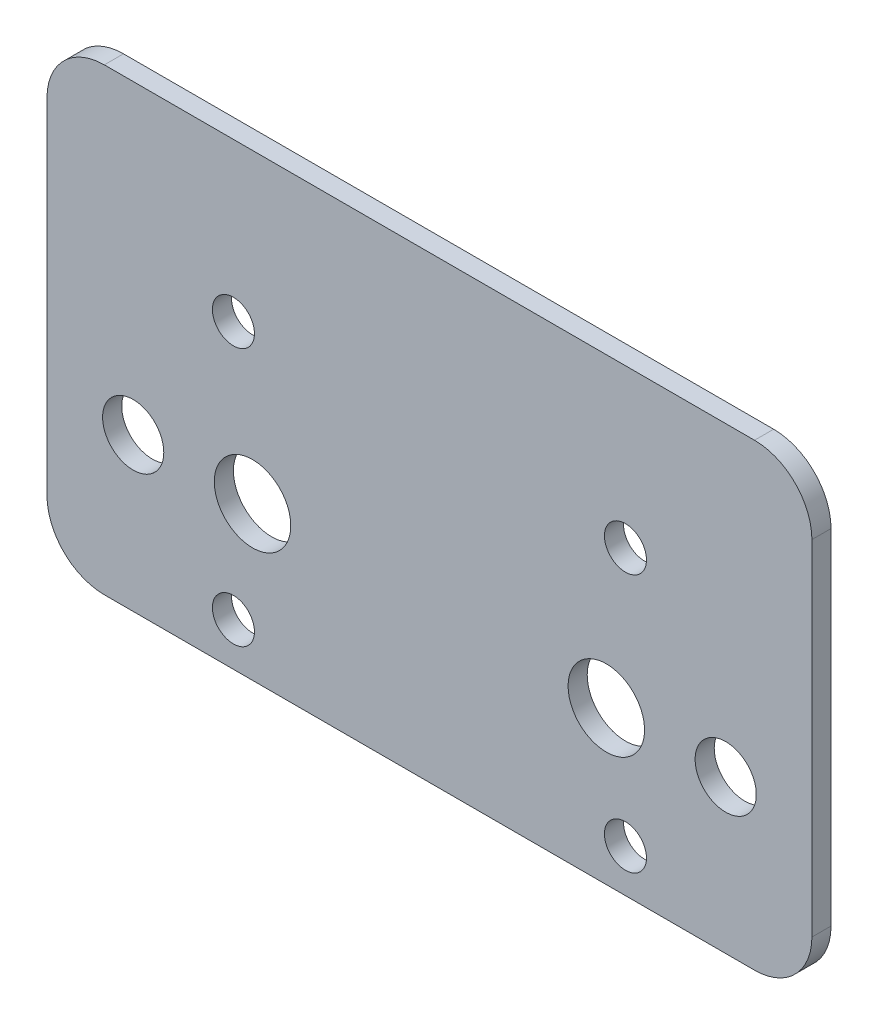
ISO-10303-21;
HEADER;
FILE_DESCRIPTION(('STEP AP214'),'2;1');
FILE_NAME('part.step','',(''),(''),'','','');
FILE_SCHEMA(('AUTOMOTIVE_DESIGN { 1 0 10303 214 1 1 1 1 }'));
ENDSEC;
DATA;
#1=APPLICATION_CONTEXT('core data for automotive mechanical design processes');
#2=APPLICATION_PROTOCOL_DEFINITION('international standard','automotive_design',2000,#1);
#3=PRODUCT_CONTEXT('',#1,'mechanical');
#4=PRODUCT('Part','Part','',(#3));
#5=PRODUCT_RELATED_PRODUCT_CATEGORY('part','',(#4));
#6=PRODUCT_DEFINITION_FORMATION('','',#4);
#7=PRODUCT_DEFINITION_CONTEXT('part definition',#1,'design');
#8=PRODUCT_DEFINITION('design','',#6,#7);
#9=PRODUCT_DEFINITION_SHAPE('','',#8);
#10=(LENGTH_UNIT() NAMED_UNIT(*) SI_UNIT(.MILLI.,.METRE.));
#11=(NAMED_UNIT(*) PLANE_ANGLE_UNIT() SI_UNIT($,.RADIAN.));
#12=(NAMED_UNIT(*) SI_UNIT($,.STERADIAN.) SOLID_ANGLE_UNIT());
#13=UNCERTAINTY_MEASURE_WITH_UNIT(LENGTH_MEASURE(1.E-05),#10,'distance_accuracy_value','');
#14=(GEOMETRIC_REPRESENTATION_CONTEXT(3) GLOBAL_UNCERTAINTY_ASSIGNED_CONTEXT((#13)) GLOBAL_UNIT_ASSIGNED_CONTEXT((#10,
#11,#12)) REPRESENTATION_CONTEXT('',''));
#15=CARTESIAN_POINT('',(0.,0.,0.));
#16=DIRECTION('',(0.,0.,1.));
#17=DIRECTION('',(1.,0.,0.));
#18=AXIS2_PLACEMENT_3D('',#15,#16,#17);
#19=CARTESIAN_POINT('',(0.,0.,1.));
#20=DIRECTION('',(0.,0.,1.));
#21=DIRECTION('',(1.,0.,0.));
#22=AXIS2_PLACEMENT_3D('',#19,#20,#21);
#23=PLANE('',#22);
#24=CARTESIAN_POINT('',(10.25,3.75,1.));
#25=DIRECTION('',(0.,0.,-1.));
#26=DIRECTION('',(-1.,0.,0.));
#27=AXIS2_PLACEMENT_3D('',#24,#25,#26);
#28=CIRCLE('',#27,1.1);
#29=CARTESIAN_POINT('',(9.15,3.75,1.));
#30=VERTEX_POINT('',#29);
#31=EDGE_CURVE('E260',#30,#30,#28,.T.);
#32=ORIENTED_EDGE('',*,*,#31,.T.);
#33=EDGE_LOOP('',(#32));
#34=FACE_BOUND('',#33,.T.);
#35=CARTESIAN_POINT('',(-10.25,-9.75,1.));
#36=DIRECTION('',(0.,0.,-1.));
#37=DIRECTION('',(-1.,0.,0.));
#38=AXIS2_PLACEMENT_3D('',#35,#36,#37);
#39=CIRCLE('',#38,1.1);
#40=CARTESIAN_POINT('',(-11.35,-9.75,1.));
#41=VERTEX_POINT('',#40);
#42=EDGE_CURVE('E245',#41,#41,#39,.T.);
#43=ORIENTED_EDGE('',*,*,#42,.T.);
#44=EDGE_LOOP('',(#43));
#45=FACE_BOUND('',#44,.T.);
#46=CARTESIAN_POINT('',(-9.25000000000001,-3.99999999999999,1.));
#47=DIRECTION('',(0.,0.,-1.));
#48=DIRECTION('',(-1.,0.,0.));
#49=AXIS2_PLACEMENT_3D('',#46,#47,#48);
#50=CIRCLE('',#49,2.);
#51=CARTESIAN_POINT('',(-11.25,-3.99999999999999,1.));
#52=VERTEX_POINT('',#51);
#53=EDGE_CURVE('E244',#52,#52,#50,.T.);
#54=ORIENTED_EDGE('',*,*,#53,.T.);
#55=EDGE_LOOP('',(#54));
#56=FACE_BOUND('',#55,.T.);
#57=CARTESIAN_POINT('',(-10.25,3.75,1.));
#58=DIRECTION('',(0.,0.,-1.));
#59=DIRECTION('',(-1.,0.,0.));
#60=AXIS2_PLACEMENT_3D('',#57,#58,#59);
#61=CIRCLE('',#60,1.1);
#62=CARTESIAN_POINT('',(-11.35,3.75,1.));
#63=VERTEX_POINT('',#62);
#64=EDGE_CURVE('E236',#63,#63,#61,.T.);
#65=ORIENTED_EDGE('',*,*,#64,.T.);
#66=EDGE_LOOP('',(#65));
#67=FACE_BOUND('',#66,.T.);
#68=CARTESIAN_POINT('',(10.25,-9.75,1.));
#69=DIRECTION('',(0.,0.,-1.));
#70=DIRECTION('',(-1.,0.,0.));
#71=AXIS2_PLACEMENT_3D('',#68,#69,#70);
#72=CIRCLE('',#71,1.1);
#73=CARTESIAN_POINT('',(9.15,-9.75,1.));
#74=VERTEX_POINT('',#73);
#75=EDGE_CURVE('E261',#74,#74,#72,.T.);
#76=ORIENTED_EDGE('',*,*,#75,.T.);
#77=EDGE_LOOP('',(#76));
#78=FACE_BOUND('',#77,.T.);
#79=CARTESIAN_POINT('',(9.24999999999999,-3.99999999999999,1.));
#80=DIRECTION('',(0.,0.,-1.));
#81=DIRECTION('',(-1.,0.,0.));
#82=AXIS2_PLACEMENT_3D('',#79,#80,#81);
#83=CIRCLE('',#82,2.);
#84=CARTESIAN_POINT('',(7.24999999999999,-3.99999999999999,1.));
#85=VERTEX_POINT('',#84);
#86=EDGE_CURVE('E228',#85,#85,#83,.T.);
#87=ORIENTED_EDGE('',*,*,#86,.T.);
#88=EDGE_LOOP('',(#87));
#89=FACE_BOUND('',#88,.T.);
#90=CARTESIAN_POINT('',(-15.4919333848297,-4.,1.));
#91=DIRECTION('',(0.,0.,1.));
#92=DIRECTION('',(1.,0.,0.));
#93=AXIS2_PLACEMENT_3D('',#90,#91,#92);
#94=CIRCLE('',#93,1.6);
#95=CARTESIAN_POINT('',(-13.8919333848297,-4.,1.));
#96=VERTEX_POINT('',#95);
#97=EDGE_CURVE('E134',#96,#96,#94,.T.);
#98=ORIENTED_EDGE('',*,*,#97,.F.);
#99=EDGE_LOOP('',(#98));
#100=FACE_BOUND('',#99,.T.);
#101=DIRECTION('',(-1.,0.,0.));
#102=VECTOR('',#101,1.);
#103=CARTESIAN_POINT('',(20.,12.,1.));
#104=LINE('',#103,#102);
#105=CARTESIAN_POINT('',(17.,12.,1.));
#106=VERTEX_POINT('',#105);
#107=CARTESIAN_POINT('',(-17.,12.,1.));
#108=VERTEX_POINT('',#107);
#109=EDGE_CURVE('E146',#106,#108,#104,.T.);
#110=ORIENTED_EDGE('',*,*,#109,.T.);
#111=CARTESIAN_POINT('',(-17.,9.,1.));
#112=DIRECTION('',(0.,0.,1.));
#113=DIRECTION('',(1.,0.,0.));
#114=AXIS2_PLACEMENT_3D('',#111,#112,#113);
#115=CIRCLE('',#114,3.);
#116=CARTESIAN_POINT('',(-20.,9.,1.));
#117=VERTEX_POINT('',#116);
#118=EDGE_CURVE('E176',#108,#117,#115,.T.);
#119=ORIENTED_EDGE('',*,*,#118,.T.);
#120=DIRECTION('',(0.,-1.,0.));
#121=VECTOR('',#120,1.);
#122=CARTESIAN_POINT('',(-20.,-12.,1.));
#123=LINE('',#122,#121);
#124=CARTESIAN_POINT('',(-20.,-9.,1.));
#125=VERTEX_POINT('',#124);
#126=EDGE_CURVE('E124',#117,#125,#123,.T.);
#127=ORIENTED_EDGE('',*,*,#126,.T.);
#128=CARTESIAN_POINT('',(-17.,-9.,1.));
#129=DIRECTION('',(0.,0.,1.));
#130=DIRECTION('',(1.,0.,0.));
#131=AXIS2_PLACEMENT_3D('',#128,#129,#130);
#132=CIRCLE('',#131,3.);
#133=CARTESIAN_POINT('',(-17.,-12.,1.));
#134=VERTEX_POINT('',#133);
#135=EDGE_CURVE('E173',#125,#134,#132,.T.);
#136=ORIENTED_EDGE('',*,*,#135,.T.);
#137=DIRECTION('',(1.,0.,0.));
#138=VECTOR('',#137,1.);
#139=CARTESIAN_POINT('',(20.,-12.,1.));
#140=LINE('',#139,#138);
#141=CARTESIAN_POINT('',(17.,-12.,1.));
#142=VERTEX_POINT('',#141);
#143=EDGE_CURVE('E209',#134,#142,#140,.T.);
#144=ORIENTED_EDGE('',*,*,#143,.T.);
#145=CARTESIAN_POINT('',(17.,-8.99999999999999,1.));
#146=DIRECTION('',(0.,0.,1.));
#147=DIRECTION('',(1.,0.,0.));
#148=AXIS2_PLACEMENT_3D('',#145,#146,#147);
#149=CIRCLE('',#148,3.);
#150=CARTESIAN_POINT('',(20.,-8.99999999999999,1.));
#151=VERTEX_POINT('',#150);
#152=EDGE_CURVE('E58',#142,#151,#149,.T.);
#153=ORIENTED_EDGE('',*,*,#152,.T.);
#154=DIRECTION('',(0.,1.,0.));
#155=VECTOR('',#154,1.);
#156=CARTESIAN_POINT('',(20.,-12.,1.));
#157=LINE('',#156,#155);
#158=CARTESIAN_POINT('',(20.,9.,1.));
#159=VERTEX_POINT('',#158);
#160=EDGE_CURVE('E206',#151,#159,#157,.T.);
#161=ORIENTED_EDGE('',*,*,#160,.T.);
#162=CARTESIAN_POINT('',(17.,9.00000000000001,1.));
#163=DIRECTION('',(0.,0.,1.));
#164=DIRECTION('',(1.,0.,0.));
#165=AXIS2_PLACEMENT_3D('',#162,#163,#164);
#166=CIRCLE('',#165,3.);
#167=EDGE_CURVE('E168',#159,#106,#166,.T.);
#168=ORIENTED_EDGE('',*,*,#167,.T.);
#169=EDGE_LOOP('',(#110,#119,#127,#136,#144,#153,#161,#168));
#170=FACE_BOUND('',#169,.T.);
#171=CARTESIAN_POINT('',(15.4919333848297,-4.,1.));
#172=DIRECTION('',(0.,0.,1.));
#173=DIRECTION('',(-1.,0.,0.));
#174=AXIS2_PLACEMENT_3D('',#171,#172,#173);
#175=CIRCLE('',#174,1.6);
#176=CARTESIAN_POINT('',(13.8919333848297,-4.,1.));
#177=VERTEX_POINT('',#176);
#178=EDGE_CURVE('E222',#177,#177,#175,.T.);
#179=ORIENTED_EDGE('',*,*,#178,.F.);
#180=EDGE_LOOP('',(#179));
#181=FACE_BOUND('',#180,.T.);
#182=ADVANCED_FACE('F36',(#34,#45,#56,#67,#78,#89,#100,#170,#181),#23,.T.);
#183=CARTESIAN_POINT('',(0.,0.,0.));
#184=DIRECTION('',(0.,0.,1.));
#185=DIRECTION('',(1.,0.,0.));
#186=AXIS2_PLACEMENT_3D('',#183,#184,#185);
#187=PLANE('',#186);
#188=CARTESIAN_POINT('',(10.25,3.75,0.));
#189=DIRECTION('',(0.,0.,-1.));
#190=DIRECTION('',(-1.,0.,0.));
#191=AXIS2_PLACEMENT_3D('',#188,#189,#190);
#192=CIRCLE('',#191,1.1);
#193=CARTESIAN_POINT('',(9.15,3.75,0.));
#194=VERTEX_POINT('',#193);
#195=EDGE_CURVE('E256',#194,#194,#192,.T.);
#196=ORIENTED_EDGE('',*,*,#195,.F.);
#197=EDGE_LOOP('',(#196));
#198=FACE_BOUND('',#197,.T.);
#199=CARTESIAN_POINT('',(-10.25,-9.75,0.));
#200=DIRECTION('',(0.,0.,-1.));
#201=DIRECTION('',(-1.,0.,0.));
#202=AXIS2_PLACEMENT_3D('',#199,#200,#201);
#203=CIRCLE('',#202,1.1);
#204=CARTESIAN_POINT('',(-11.35,-9.75,0.));
#205=VERTEX_POINT('',#204);
#206=EDGE_CURVE('E265',#205,#205,#203,.T.);
#207=ORIENTED_EDGE('',*,*,#206,.F.);
#208=EDGE_LOOP('',(#207));
#209=FACE_BOUND('',#208,.T.);
#210=CARTESIAN_POINT('',(-9.25000000000001,-3.99999999999999,0.));
#211=DIRECTION('',(0.,0.,-1.));
#212=DIRECTION('',(-1.,0.,0.));
#213=AXIS2_PLACEMENT_3D('',#210,#211,#212);
#214=CIRCLE('',#213,2.);
#215=CARTESIAN_POINT('',(-11.25,-3.99999999999999,0.));
#216=VERTEX_POINT('',#215);
#217=EDGE_CURVE('E240',#216,#216,#214,.T.);
#218=ORIENTED_EDGE('',*,*,#217,.F.);
#219=EDGE_LOOP('',(#218));
#220=FACE_BOUND('',#219,.T.);
#221=CARTESIAN_POINT('',(-10.25,3.75,0.));
#222=DIRECTION('',(0.,0.,-1.));
#223=DIRECTION('',(-1.,0.,0.));
#224=AXIS2_PLACEMENT_3D('',#221,#222,#223);
#225=CIRCLE('',#224,1.1);
#226=CARTESIAN_POINT('',(-11.35,3.75,0.));
#227=VERTEX_POINT('',#226);
#228=EDGE_CURVE('E249',#227,#227,#225,.T.);
#229=ORIENTED_EDGE('',*,*,#228,.F.);
#230=EDGE_LOOP('',(#229));
#231=FACE_BOUND('',#230,.T.);
#232=CARTESIAN_POINT('',(10.25,-9.75,0.));
#233=DIRECTION('',(0.,0.,-1.));
#234=DIRECTION('',(-1.,0.,0.));
#235=AXIS2_PLACEMENT_3D('',#232,#233,#234);
#236=CIRCLE('',#235,1.1);
#237=CARTESIAN_POINT('',(9.15,-9.75,0.));
#238=VERTEX_POINT('',#237);
#239=EDGE_CURVE('E272',#238,#238,#236,.T.);
#240=ORIENTED_EDGE('',*,*,#239,.F.);
#241=EDGE_LOOP('',(#240));
#242=FACE_BOUND('',#241,.T.);
#243=CARTESIAN_POINT('',(9.24999999999999,-3.99999999999999,0.));
#244=DIRECTION('',(0.,0.,-1.));
#245=DIRECTION('',(-1.,0.,0.));
#246=AXIS2_PLACEMENT_3D('',#243,#244,#245);
#247=CIRCLE('',#246,2.);
#248=CARTESIAN_POINT('',(7.24999999999999,-3.99999999999999,0.));
#249=VERTEX_POINT('',#248);
#250=EDGE_CURVE('E232',#249,#249,#247,.T.);
#251=ORIENTED_EDGE('',*,*,#250,.F.);
#252=EDGE_LOOP('',(#251));
#253=FACE_BOUND('',#252,.T.);
#254=DIRECTION('',(0.,-1.,0.));
#255=VECTOR('',#254,1.);
#256=CARTESIAN_POINT('',(-20.,-12.,0.));
#257=LINE('',#256,#255);
#258=CARTESIAN_POINT('',(-20.,9.,0.));
#259=VERTEX_POINT('',#258);
#260=CARTESIAN_POINT('',(-20.,-9.,0.));
#261=VERTEX_POINT('',#260);
#262=EDGE_CURVE('E121',#259,#261,#257,.T.);
#263=ORIENTED_EDGE('',*,*,#262,.F.);
#264=CARTESIAN_POINT('',(-17.,9.,0.));
#265=DIRECTION('',(0.,0.,1.));
#266=DIRECTION('',(1.,0.,0.));
#267=AXIS2_PLACEMENT_3D('',#264,#265,#266);
#268=CIRCLE('',#267,3.);
#269=CARTESIAN_POINT('',(-17.,12.,0.));
#270=VERTEX_POINT('',#269);
#271=EDGE_CURVE('E103',#259,#270,#268,.F.);
#272=ORIENTED_EDGE('',*,*,#271,.T.);
#273=DIRECTION('',(-1.,0.,0.));
#274=VECTOR('',#273,1.);
#275=CARTESIAN_POINT('',(20.,12.,0.));
#276=LINE('',#275,#274);
#277=CARTESIAN_POINT('',(17.,12.,0.));
#278=VERTEX_POINT('',#277);
#279=EDGE_CURVE('E151',#278,#270,#276,.T.);
#280=ORIENTED_EDGE('',*,*,#279,.F.);
#281=CARTESIAN_POINT('',(17.,9.00000000000001,0.));
#282=DIRECTION('',(0.,0.,1.));
#283=DIRECTION('',(1.,0.,0.));
#284=AXIS2_PLACEMENT_3D('',#281,#282,#283);
#285=CIRCLE('',#284,3.);
#286=CARTESIAN_POINT('',(20.,9.,0.));
#287=VERTEX_POINT('',#286);
#288=EDGE_CURVE('E126',#278,#287,#285,.F.);
#289=ORIENTED_EDGE('',*,*,#288,.T.);
#290=DIRECTION('',(0.,1.,0.));
#291=VECTOR('',#290,1.);
#292=CARTESIAN_POINT('',(20.,-12.,0.));
#293=LINE('',#292,#291);
#294=CARTESIAN_POINT('',(20.,-8.99999999999999,0.));
#295=VERTEX_POINT('',#294);
#296=EDGE_CURVE('E140',#295,#287,#293,.T.);
#297=ORIENTED_EDGE('',*,*,#296,.F.);
#298=CARTESIAN_POINT('',(17.,-8.99999999999999,0.));
#299=DIRECTION('',(0.,0.,1.));
#300=DIRECTION('',(1.,0.,0.));
#301=AXIS2_PLACEMENT_3D('',#298,#299,#300);
#302=CIRCLE('',#301,3.);
#303=CARTESIAN_POINT('',(17.,-12.,0.));
#304=VERTEX_POINT('',#303);
#305=EDGE_CURVE('E158',#295,#304,#302,.F.);
#306=ORIENTED_EDGE('',*,*,#305,.T.);
#307=DIRECTION('',(1.,0.,0.));
#308=VECTOR('',#307,1.);
#309=CARTESIAN_POINT('',(20.,-12.,0.));
#310=LINE('',#309,#308);
#311=CARTESIAN_POINT('',(-17.,-12.,0.));
#312=VERTEX_POINT('',#311);
#313=EDGE_CURVE('E133',#312,#304,#310,.T.);
#314=ORIENTED_EDGE('',*,*,#313,.F.);
#315=CARTESIAN_POINT('',(-17.,-9.,0.));
#316=DIRECTION('',(0.,0.,1.));
#317=DIRECTION('',(1.,0.,0.));
#318=AXIS2_PLACEMENT_3D('',#315,#316,#317);
#319=CIRCLE('',#318,3.);
#320=EDGE_CURVE('E115',#312,#261,#319,.F.);
#321=ORIENTED_EDGE('',*,*,#320,.T.);
#322=EDGE_LOOP('',(#263,#272,#280,#289,#297,#306,#314,#321));
#323=FACE_BOUND('',#322,.T.);
#324=CARTESIAN_POINT('',(-15.4919333848297,-4.,0.));
#325=DIRECTION('',(0.,0.,1.));
#326=DIRECTION('',(1.,0.,0.));
#327=AXIS2_PLACEMENT_3D('',#324,#325,#326);
#328=CIRCLE('',#327,1.6);
#329=CARTESIAN_POINT('',(-13.8919333848297,-4.,0.));
#330=VERTEX_POINT('',#329);
#331=EDGE_CURVE('E143',#330,#330,#328,.T.);
#332=ORIENTED_EDGE('',*,*,#331,.T.);
#333=EDGE_LOOP('',(#332));
#334=FACE_BOUND('',#333,.T.);
#335=CARTESIAN_POINT('',(15.4919333848297,-4.,0.));
#336=DIRECTION('',(0.,0.,1.));
#337=DIRECTION('',(-1.,0.,0.));
#338=AXIS2_PLACEMENT_3D('',#335,#336,#337);
#339=CIRCLE('',#338,1.6);
#340=CARTESIAN_POINT('',(13.8919333848297,-4.,0.));
#341=VERTEX_POINT('',#340);
#342=EDGE_CURVE('E224',#341,#341,#339,.T.);
#343=ORIENTED_EDGE('',*,*,#342,.T.);
#344=EDGE_LOOP('',(#343));
#345=FACE_BOUND('',#344,.T.);
#346=ADVANCED_FACE('F129',(#198,#209,#220,#231,#242,#253,#323,#334,#345),#187,.F.);
#347=CARTESIAN_POINT('',(-20.,-12.,1.));
#348=DIRECTION('',(1.,0.,0.));
#349=DIRECTION('',(0.,0.,-1.));
#350=AXIS2_PLACEMENT_3D('',#347,#348,#349);
#351=PLANE('',#350);
#352=ORIENTED_EDGE('',*,*,#126,.F.);
#353=DIRECTION('',(0.,0.,-1.));
#354=VECTOR('',#353,1.);
#355=CARTESIAN_POINT('',(-20.,9.,1.));
#356=LINE('',#355,#354);
#357=EDGE_CURVE('E107',#117,#259,#356,.T.);
#358=ORIENTED_EDGE('',*,*,#357,.T.);
#359=ORIENTED_EDGE('',*,*,#262,.T.);
#360=DIRECTION('',(0.,0.,-1.));
#361=VECTOR('',#360,1.);
#362=CARTESIAN_POINT('',(-20.,-9.,1.));
#363=LINE('',#362,#361);
#364=EDGE_CURVE('E127',#261,#125,#363,.F.);
#365=ORIENTED_EDGE('',*,*,#364,.T.);
#366=EDGE_LOOP('',(#352,#358,#359,#365));
#367=FACE_BOUND('',#366,.T.);
#368=ADVANCED_FACE('F120',(#367),#351,.F.);
#369=CARTESIAN_POINT('',(20.,-12.,1.));
#370=DIRECTION('',(0.,1.,0.));
#371=DIRECTION('',(-1.,0.,0.));
#372=AXIS2_PLACEMENT_3D('',#369,#370,#371);
#373=PLANE('',#372);
#374=ORIENTED_EDGE('',*,*,#143,.F.);
#375=DIRECTION('',(0.,0.,-1.));
#376=VECTOR('',#375,1.);
#377=CARTESIAN_POINT('',(-17.,-12.,1.));
#378=LINE('',#377,#376);
#379=EDGE_CURVE('E182',#134,#312,#378,.T.);
#380=ORIENTED_EDGE('',*,*,#379,.T.);
#381=ORIENTED_EDGE('',*,*,#313,.T.);
#382=DIRECTION('',(0.,0.,-1.));
#383=VECTOR('',#382,1.);
#384=CARTESIAN_POINT('',(17.,-12.,1.));
#385=LINE('',#384,#383);
#386=EDGE_CURVE('E179',#304,#142,#385,.F.);
#387=ORIENTED_EDGE('',*,*,#386,.T.);
#388=EDGE_LOOP('',(#374,#380,#381,#387));
#389=FACE_BOUND('',#388,.T.);
#390=ADVANCED_FACE('F319',(#389),#373,.F.);
#391=CARTESIAN_POINT('',(20.,-12.,1.));
#392=DIRECTION('',(-1.,0.,0.));
#393=DIRECTION('',(0.,0.,1.));
#394=AXIS2_PLACEMENT_3D('',#391,#392,#393);
#395=PLANE('',#394);
#396=ORIENTED_EDGE('',*,*,#160,.F.);
#397=DIRECTION('',(0.,0.,-1.));
#398=VECTOR('',#397,1.);
#399=CARTESIAN_POINT('',(20.,-8.99999999999999,1.));
#400=LINE('',#399,#398);
#401=EDGE_CURVE('E11',#151,#295,#400,.T.);
#402=ORIENTED_EDGE('',*,*,#401,.T.);
#403=ORIENTED_EDGE('',*,*,#296,.T.);
#404=DIRECTION('',(0.,0.,-1.));
#405=VECTOR('',#404,1.);
#406=CARTESIAN_POINT('',(20.,9.,1.));
#407=LINE('',#406,#405);
#408=EDGE_CURVE('E45',#287,#159,#407,.F.);
#409=ORIENTED_EDGE('',*,*,#408,.T.);
#410=EDGE_LOOP('',(#396,#402,#403,#409));
#411=FACE_BOUND('',#410,.T.);
#412=ADVANCED_FACE('F315',(#411),#395,.F.);
#413=CARTESIAN_POINT('',(20.,12.,1.));
#414=DIRECTION('',(0.,-1.,0.));
#415=DIRECTION('',(1.,0.,0.));
#416=AXIS2_PLACEMENT_3D('',#413,#414,#415);
#417=PLANE('',#416);
#418=ORIENTED_EDGE('',*,*,#279,.T.);
#419=DIRECTION('',(0.,0.,-1.));
#420=VECTOR('',#419,1.);
#421=CARTESIAN_POINT('',(-17.,12.,1.));
#422=LINE('',#421,#420);
#423=EDGE_CURVE('E108',#270,#108,#422,.F.);
#424=ORIENTED_EDGE('',*,*,#423,.T.);
#425=ORIENTED_EDGE('',*,*,#109,.F.);
#426=DIRECTION('',(0.,0.,-1.));
#427=VECTOR('',#426,1.);
#428=CARTESIAN_POINT('',(17.,12.,1.));
#429=LINE('',#428,#427);
#430=EDGE_CURVE('E114',#106,#278,#429,.T.);
#431=ORIENTED_EDGE('',*,*,#430,.T.);
#432=EDGE_LOOP('',(#418,#424,#425,#431));
#433=FACE_BOUND('',#432,.T.);
#434=ADVANCED_FACE('F312',(#433),#417,.F.);
#435=CARTESIAN_POINT('',(-15.4919333848297,-4.,1.));
#436=DIRECTION('',(0.,0.,-1.));
#437=DIRECTION('',(-1.,0.,0.));
#438=AXIS2_PLACEMENT_3D('',#435,#436,#437);
#439=CYLINDRICAL_SURFACE('',#438,1.6);
#440=ORIENTED_EDGE('',*,*,#97,.T.);
#441=EDGE_LOOP('',(#440));
#442=FACE_BOUND('',#441,.T.);
#443=ORIENTED_EDGE('',*,*,#331,.F.);
#444=EDGE_LOOP('',(#443));
#445=FACE_BOUND('',#444,.T.);
#446=ADVANCED_FACE('F309',(#442,#445),#439,.F.);
#447=CARTESIAN_POINT('',(15.4919333848297,-4.,1.));
#448=DIRECTION('',(0.,0.,-1.));
#449=DIRECTION('',(-1.,0.,0.));
#450=AXIS2_PLACEMENT_3D('',#447,#448,#449);
#451=CYLINDRICAL_SURFACE('',#450,1.6);
#452=ORIENTED_EDGE('',*,*,#178,.T.);
#453=EDGE_LOOP('',(#452));
#454=FACE_BOUND('',#453,.T.);
#455=ORIENTED_EDGE('',*,*,#342,.F.);
#456=EDGE_LOOP('',(#455));
#457=FACE_BOUND('',#456,.T.);
#458=ADVANCED_FACE('F328',(#454,#457),#451,.F.);
#459=CARTESIAN_POINT('',(-17.,9.,1.));
#460=DIRECTION('',(0.,0.,-1.));
#461=DIRECTION('',(-1.,0.,0.));
#462=AXIS2_PLACEMENT_3D('',#459,#460,#461);
#463=CYLINDRICAL_SURFACE('',#462,3.);
#464=ORIENTED_EDGE('',*,*,#118,.F.);
#465=ORIENTED_EDGE('',*,*,#423,.F.);
#466=ORIENTED_EDGE('',*,*,#271,.F.);
#467=ORIENTED_EDGE('',*,*,#357,.F.);
#468=EDGE_LOOP('',(#464,#465,#466,#467));
#469=FACE_BOUND('',#468,.T.);
#470=ADVANCED_FACE('F106',(#469),#463,.T.);
#471=CARTESIAN_POINT('',(-17.,-9.,1.));
#472=DIRECTION('',(0.,0.,-1.));
#473=DIRECTION('',(-1.,0.,0.));
#474=AXIS2_PLACEMENT_3D('',#471,#472,#473);
#475=CYLINDRICAL_SURFACE('',#474,3.);
#476=ORIENTED_EDGE('',*,*,#135,.F.);
#477=ORIENTED_EDGE('',*,*,#364,.F.);
#478=ORIENTED_EDGE('',*,*,#320,.F.);
#479=ORIENTED_EDGE('',*,*,#379,.F.);
#480=EDGE_LOOP('',(#476,#477,#478,#479));
#481=FACE_BOUND('',#480,.T.);
#482=ADVANCED_FACE('F327',(#481),#475,.T.);
#483=CARTESIAN_POINT('',(17.,-8.99999999999999,1.));
#484=DIRECTION('',(0.,0.,-1.));
#485=DIRECTION('',(-1.,0.,0.));
#486=AXIS2_PLACEMENT_3D('',#483,#484,#485);
#487=CYLINDRICAL_SURFACE('',#486,3.);
#488=ORIENTED_EDGE('',*,*,#152,.F.);
#489=ORIENTED_EDGE('',*,*,#386,.F.);
#490=ORIENTED_EDGE('',*,*,#305,.F.);
#491=ORIENTED_EDGE('',*,*,#401,.F.);
#492=EDGE_LOOP('',(#488,#489,#490,#491));
#493=FACE_BOUND('',#492,.T.);
#494=ADVANCED_FACE('F330',(#493),#487,.T.);
#495=CARTESIAN_POINT('',(17.,9.00000000000001,1.));
#496=DIRECTION('',(0.,0.,-1.));
#497=DIRECTION('',(-1.,0.,0.));
#498=AXIS2_PLACEMENT_3D('',#495,#496,#497);
#499=CYLINDRICAL_SURFACE('',#498,3.);
#500=ORIENTED_EDGE('',*,*,#167,.F.);
#501=ORIENTED_EDGE('',*,*,#408,.F.);
#502=ORIENTED_EDGE('',*,*,#288,.F.);
#503=ORIENTED_EDGE('',*,*,#430,.F.);
#504=EDGE_LOOP('',(#500,#501,#502,#503));
#505=FACE_BOUND('',#504,.T.);
#506=ADVANCED_FACE('F38',(#505),#499,.T.);
#507=CARTESIAN_POINT('',(9.24999999999999,-3.99999999999999,1.));
#508=DIRECTION('',(0.,0.,-1.));
#509=DIRECTION('',(-1.,0.,0.));
#510=AXIS2_PLACEMENT_3D('',#507,#508,#509);
#511=CYLINDRICAL_SURFACE('',#510,2.);
#512=ORIENTED_EDGE('',*,*,#250,.T.);
#513=EDGE_LOOP('',(#512));
#514=FACE_BOUND('',#513,.T.);
#515=ORIENTED_EDGE('',*,*,#86,.F.);
#516=EDGE_LOOP('',(#515));
#517=FACE_BOUND('',#516,.T.);
#518=ADVANCED_FACE('F286',(#514,#517),#511,.F.);
#519=CARTESIAN_POINT('',(10.25,-9.75,1.));
#520=DIRECTION('',(0.,0.,-1.));
#521=DIRECTION('',(-1.,0.,0.));
#522=AXIS2_PLACEMENT_3D('',#519,#520,#521);
#523=CYLINDRICAL_SURFACE('',#522,1.1);
#524=ORIENTED_EDGE('',*,*,#239,.T.);
#525=EDGE_LOOP('',(#524));
#526=FACE_BOUND('',#525,.T.);
#527=ORIENTED_EDGE('',*,*,#75,.F.);
#528=EDGE_LOOP('',(#527));
#529=FACE_BOUND('',#528,.T.);
#530=ADVANCED_FACE('F283',(#526,#529),#523,.F.);
#531=CARTESIAN_POINT('',(-10.25,3.75,1.));
#532=DIRECTION('',(0.,0.,-1.));
#533=DIRECTION('',(-1.,0.,0.));
#534=AXIS2_PLACEMENT_3D('',#531,#532,#533);
#535=CYLINDRICAL_SURFACE('',#534,1.1);
#536=ORIENTED_EDGE('',*,*,#228,.T.);
#537=EDGE_LOOP('',(#536));
#538=FACE_BOUND('',#537,.T.);
#539=ORIENTED_EDGE('',*,*,#64,.F.);
#540=EDGE_LOOP('',(#539));
#541=FACE_BOUND('',#540,.T.);
#542=ADVANCED_FACE('F285',(#538,#541),#535,.F.);
#543=CARTESIAN_POINT('',(-9.25000000000001,-3.99999999999999,1.));
#544=DIRECTION('',(0.,0.,-1.));
#545=DIRECTION('',(-1.,0.,0.));
#546=AXIS2_PLACEMENT_3D('',#543,#544,#545);
#547=CYLINDRICAL_SURFACE('',#546,2.);
#548=ORIENTED_EDGE('',*,*,#217,.T.);
#549=EDGE_LOOP('',(#548));
#550=FACE_BOUND('',#549,.T.);
#551=ORIENTED_EDGE('',*,*,#53,.F.);
#552=EDGE_LOOP('',(#551));
#553=FACE_BOUND('',#552,.T.);
#554=ADVANCED_FACE('F293',(#550,#553),#547,.F.);
#555=CARTESIAN_POINT('',(-10.25,-9.75,1.));
#556=DIRECTION('',(0.,0.,-1.));
#557=DIRECTION('',(-1.,0.,0.));
#558=AXIS2_PLACEMENT_3D('',#555,#556,#557);
#559=CYLINDRICAL_SURFACE('',#558,1.1);
#560=ORIENTED_EDGE('',*,*,#206,.T.);
#561=EDGE_LOOP('',(#560));
#562=FACE_BOUND('',#561,.T.);
#563=ORIENTED_EDGE('',*,*,#42,.F.);
#564=EDGE_LOOP('',(#563));
#565=FACE_BOUND('',#564,.T.);
#566=ADVANCED_FACE('F357',(#562,#565),#559,.F.);
#567=CARTESIAN_POINT('',(10.25,3.75,1.));
#568=DIRECTION('',(0.,0.,-1.));
#569=DIRECTION('',(-1.,0.,0.));
#570=AXIS2_PLACEMENT_3D('',#567,#568,#569);
#571=CYLINDRICAL_SURFACE('',#570,1.1);
#572=ORIENTED_EDGE('',*,*,#195,.T.);
#573=EDGE_LOOP('',(#572));
#574=FACE_BOUND('',#573,.T.);
#575=ORIENTED_EDGE('',*,*,#31,.F.);
#576=EDGE_LOOP('',(#575));
#577=FACE_BOUND('',#576,.T.);
#578=ADVANCED_FACE('F360',(#574,#577),#571,.F.);
#579=CLOSED_SHELL('',(#182,#346,#368,#390,#412,#434,#446,#458,#470,#482,#494,#506,#518,#530,
#542,#554,#566,#578));
#580=MANIFOLD_SOLID_BREP('B2',#579);
#581=ADVANCED_BREP_SHAPE_REPRESENTATION('',(#18,#580),#14);
#582=SHAPE_DEFINITION_REPRESENTATION(#9,#581);
ENDSEC;
END-ISO-10303-21;
